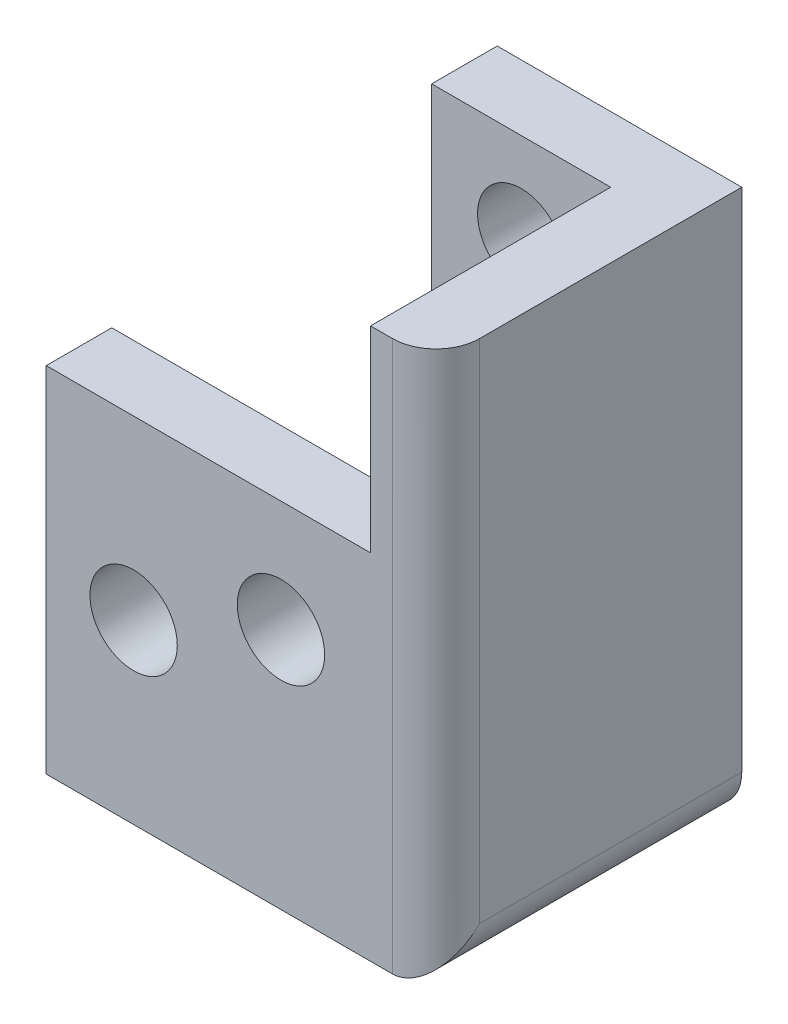
ISO-10303-21;
HEADER;
FILE_DESCRIPTION(('STEP AP214'),'2;1');
FILE_NAME('part.step','',(''),(''),'','','');
FILE_SCHEMA(('AUTOMOTIVE_DESIGN { 1 0 10303 214 1 1 1 1 }'));
ENDSEC;
DATA;
#1=APPLICATION_CONTEXT('core data for automotive mechanical design processes');
#2=APPLICATION_PROTOCOL_DEFINITION('international standard','automotive_design',2000,#1);
#3=PRODUCT_CONTEXT('',#1,'mechanical');
#4=PRODUCT('Part','Part','',(#3));
#5=PRODUCT_RELATED_PRODUCT_CATEGORY('part','',(#4));
#6=PRODUCT_DEFINITION_FORMATION('','',#4);
#7=PRODUCT_DEFINITION_CONTEXT('part definition',#1,'design');
#8=PRODUCT_DEFINITION('design','',#6,#7);
#9=PRODUCT_DEFINITION_SHAPE('','',#8);
#10=(LENGTH_UNIT() NAMED_UNIT(*) SI_UNIT(.MILLI.,.METRE.));
#11=(NAMED_UNIT(*) PLANE_ANGLE_UNIT() SI_UNIT($,.RADIAN.));
#12=(NAMED_UNIT(*) SI_UNIT($,.STERADIAN.) SOLID_ANGLE_UNIT());
#13=UNCERTAINTY_MEASURE_WITH_UNIT(LENGTH_MEASURE(1.E-05),#10,'distance_accuracy_value','');
#14=(GEOMETRIC_REPRESENTATION_CONTEXT(3) GLOBAL_UNCERTAINTY_ASSIGNED_CONTEXT((#13)) GLOBAL_UNIT_ASSIGNED_CONTEXT((#10,
#11,#12)) REPRESENTATION_CONTEXT('',''));
#15=CARTESIAN_POINT('',(0.,0.,0.));
#16=DIRECTION('',(0.,0.,1.));
#17=DIRECTION('',(1.,0.,0.));
#18=AXIS2_PLACEMENT_3D('',#15,#16,#17);
#19=CARTESIAN_POINT('',(31.36,9.1,5.));
#20=DIRECTION('',(0.,0.,-1.));
#21=DIRECTION('',(-1.,0.,0.));
#22=AXIS2_PLACEMENT_3D('',#19,#20,#21);
#23=PLANE('',#22);
#24=DIRECTION('',(0.,1.,0.));
#25=VECTOR('',#24,1.);
#26=CARTESIAN_POINT('',(20.15,-34.028747864812,5.));
#27=LINE('',#26,#25);
#28=CARTESIAN_POINT('',(20.15,-16.1,5.));
#29=VERTEX_POINT('',#28);
#30=CARTESIAN_POINT('',(20.15,9.1,5.));
#31=VERTEX_POINT('',#30);
#32=EDGE_CURVE('E223',#29,#31,#27,.T.);
#33=ORIENTED_EDGE('',*,*,#32,.T.);
#34=DIRECTION('',(-1.,0.,0.));
#35=VECTOR('',#34,1.);
#36=CARTESIAN_POINT('',(28.35,9.1,5.));
#37=LINE('',#36,#35);
#38=CARTESIAN_POINT('',(31.35,9.1,5.));
#39=VERTEX_POINT('',#38);
#40=EDGE_CURVE('E189',#39,#31,#37,.T.);
#41=ORIENTED_EDGE('',*,*,#40,.F.);
#42=DIRECTION('',(0.,1.,0.));
#43=VECTOR('',#42,1.);
#44=CARTESIAN_POINT('',(31.35,-9.9,5.));
#45=LINE('',#44,#43);
#46=CARTESIAN_POINT('',(31.35,-14.1,5.));
#47=VERTEX_POINT('',#46);
#48=EDGE_CURVE('E132',#47,#39,#45,.T.);
#49=ORIENTED_EDGE('',*,*,#48,.F.);
#50=CARTESIAN_POINT('',(29.35,-14.1,5.));
#51=DIRECTION('',(0.,0.,-1.));
#52=DIRECTION('',(-1.,0.,0.));
#53=AXIS2_PLACEMENT_3D('',#50,#51,#52);
#54=CIRCLE('',#53,2.);
#55=CARTESIAN_POINT('',(29.35,-16.1,5.));
#56=VERTEX_POINT('',#55);
#57=EDGE_CURVE('E126',#47,#56,#54,.T.);
#58=ORIENTED_EDGE('',*,*,#57,.T.);
#59=DIRECTION('',(1.,0.,0.));
#60=VECTOR('',#59,1.);
#61=CARTESIAN_POINT('',(31.35,-16.1,5.));
#62=LINE('',#61,#60);
#63=EDGE_CURVE('E129',#29,#56,#62,.T.);
#64=ORIENTED_EDGE('',*,*,#63,.F.);
#65=EDGE_LOOP('',(#33,#41,#49,#58,#64));
#66=FACE_BOUND('',#65,.T.);
#67=CARTESIAN_POINT('',(24.25,-5.,5.));
#68=DIRECTION('',(0.,0.,1.));
#69=DIRECTION('',(1.,0.,0.));
#70=AXIS2_PLACEMENT_3D('',#67,#68,#69);
#71=CIRCLE('',#70,2.06222730848998);
#72=CARTESIAN_POINT('',(26.31222730849,-5.,5.));
#73=VERTEX_POINT('',#72);
#74=EDGE_CURVE('E41',#73,#73,#71,.F.);
#75=ORIENTED_EDGE('',*,*,#74,.F.);
#76=EDGE_LOOP('',(#75));
#77=FACE_BOUND('',#76,.T.);
#78=CARTESIAN_POINT('',(24.25,5.,5.));
#79=DIRECTION('',(0.,0.,-1.));
#80=DIRECTION('',(-1.,0.,0.));
#81=AXIS2_PLACEMENT_3D('',#78,#79,#80);
#82=CIRCLE('',#81,1.99999999999997);
#83=CARTESIAN_POINT('',(22.25,5.,5.));
#84=VERTEX_POINT('',#83);
#85=EDGE_CURVE('E137',#84,#84,#82,.T.);
#86=ORIENTED_EDGE('',*,*,#85,.F.);
#87=EDGE_LOOP('',(#86));
#88=FACE_BOUND('',#87,.T.);
#89=ADVANCED_FACE('F37',(#66,#77,#88),#23,.T.);
#90=CARTESIAN_POINT('',(24.25,5.,5.));
#91=DIRECTION('',(0.,0.,-1.));
#92=DIRECTION('',(-1.,0.,0.));
#93=AXIS2_PLACEMENT_3D('',#90,#91,#92);
#94=CYLINDRICAL_SURFACE('',#93,1.99999999999997);
#95=CARTESIAN_POINT('',(24.25,5.,8.));
#96=DIRECTION('',(0.,0.,1.));
#97=DIRECTION('',(1.,0.,0.));
#98=AXIS2_PLACEMENT_3D('',#95,#96,#97);
#99=CIRCLE('',#98,1.99999999999997);
#100=CARTESIAN_POINT('',(26.25,5.,8.));
#101=VERTEX_POINT('',#100);
#102=EDGE_CURVE('E172',#101,#101,#99,.T.);
#103=ORIENTED_EDGE('',*,*,#102,.T.);
#104=EDGE_LOOP('',(#103));
#105=FACE_BOUND('',#104,.T.);
#106=ORIENTED_EDGE('',*,*,#85,.T.);
#107=EDGE_LOOP('',(#106));
#108=FACE_BOUND('',#107,.T.);
#109=ADVANCED_FACE('F39',(#105,#108),#94,.F.);
#110=CARTESIAN_POINT('',(28.35,-9.9,19.));
#111=DIRECTION('',(1.,0.,0.));
#112=DIRECTION('',(0.,0.,-1.));
#113=AXIS2_PLACEMENT_3D('',#110,#111,#112);
#114=PLANE('',#113);
#115=DIRECTION('',(0.,0.,-1.));
#116=VECTOR('',#115,1.);
#117=CARTESIAN_POINT('',(28.35,-13.1,24.7315519811772));
#118=LINE('',#117,#116);
#119=CARTESIAN_POINT('',(28.35,-13.1,16.));
#120=VERTEX_POINT('',#119);
#121=CARTESIAN_POINT('',(28.35,-13.1,8.));
#122=VERTEX_POINT('',#121);
#123=EDGE_CURVE('E54',#120,#122,#118,.T.);
#124=ORIENTED_EDGE('',*,*,#123,.F.);
#125=DIRECTION('',(0.,1.,0.));
#126=VECTOR('',#125,1.);
#127=CARTESIAN_POINT('',(28.35,-9.9,16.));
#128=LINE('',#127,#126);
#129=CARTESIAN_POINT('',(28.35,0.0999999999999994,16.));
#130=VERTEX_POINT('',#129);
#131=EDGE_CURVE('E205',#120,#130,#128,.T.);
#132=ORIENTED_EDGE('',*,*,#131,.T.);
#133=DIRECTION('',(0.,0.,1.));
#134=VECTOR('',#133,1.);
#135=CARTESIAN_POINT('',(28.35,0.0999999999999994,16.));
#136=LINE('',#135,#134);
#137=CARTESIAN_POINT('',(28.35,0.0999999999999994,19.));
#138=VERTEX_POINT('',#137);
#139=EDGE_CURVE('E194',#130,#138,#136,.T.);
#140=ORIENTED_EDGE('',*,*,#139,.T.);
#141=DIRECTION('',(0.,-1.,0.));
#142=VECTOR('',#141,1.);
#143=CARTESIAN_POINT('',(28.35,-9.9,19.));
#144=LINE('',#143,#142);
#145=CARTESIAN_POINT('',(28.35,9.1,19.));
#146=VERTEX_POINT('',#145);
#147=EDGE_CURVE('E186',#146,#138,#144,.T.);
#148=ORIENTED_EDGE('',*,*,#147,.F.);
#149=DIRECTION('',(0.,0.,-1.));
#150=VECTOR('',#149,1.);
#151=CARTESIAN_POINT('',(28.35,9.1,19.));
#152=LINE('',#151,#150);
#153=CARTESIAN_POINT('',(28.35,9.1,8.));
#154=VERTEX_POINT('',#153);
#155=EDGE_CURVE('E181',#146,#154,#152,.T.);
#156=ORIENTED_EDGE('',*,*,#155,.T.);
#157=DIRECTION('',(0.,1.,0.));
#158=VECTOR('',#157,1.);
#159=CARTESIAN_POINT('',(28.35,-9.9,8.));
#160=LINE('',#159,#158);
#161=EDGE_CURVE('E167',#122,#154,#160,.T.);
#162=ORIENTED_EDGE('',*,*,#161,.F.);
#163=EDGE_LOOP('',(#124,#132,#140,#148,#156,#162));
#164=FACE_BOUND('',#163,.T.);
#165=ADVANCED_FACE('F249',(#164),#114,.F.);
#166=CARTESIAN_POINT('',(17.5,-8.,16.));
#167=DIRECTION('',(0.,0.,1.));
#168=DIRECTION('',(1.,0.,0.));
#169=AXIS2_PLACEMENT_3D('',#166,#167,#168);
#170=CYLINDRICAL_SURFACE('',#169,2.);
#171=CARTESIAN_POINT('',(17.5,-8.,16.));
#172=DIRECTION('',(0.,0.,1.));
#173=DIRECTION('',(1.,0.,0.));
#174=AXIS2_PLACEMENT_3D('',#171,#172,#173);
#175=CIRCLE('',#174,2.);
#176=CARTESIAN_POINT('',(19.5,-8.,16.));
#177=VERTEX_POINT('',#176);
#178=EDGE_CURVE('E211',#177,#177,#175,.T.);
#179=ORIENTED_EDGE('',*,*,#178,.F.);
#180=EDGE_LOOP('',(#179));
#181=FACE_BOUND('',#180,.T.);
#182=CARTESIAN_POINT('',(17.5,-8.,19.));
#183=DIRECTION('',(0.,0.,1.));
#184=DIRECTION('',(1.,0.,0.));
#185=AXIS2_PLACEMENT_3D('',#182,#183,#184);
#186=CIRCLE('',#185,2.);
#187=CARTESIAN_POINT('',(19.5,-8.,19.));
#188=VERTEX_POINT('',#187);
#189=EDGE_CURVE('E146',#188,#188,#186,.T.);
#190=ORIENTED_EDGE('',*,*,#189,.T.);
#191=EDGE_LOOP('',(#190));
#192=FACE_BOUND('',#191,.T.);
#193=ADVANCED_FACE('F278',(#181,#192),#170,.F.);
#194=CARTESIAN_POINT('',(24.25,-5.,24.6568542494924));
#195=DIRECTION('',(0.,0.,-1.));
#196=DIRECTION('',(-1.,0.,0.));
#197=AXIS2_PLACEMENT_3D('',#194,#195,#196);
#198=CYLINDRICAL_SURFACE('',#197,2.);
#199=CARTESIAN_POINT('',(24.25,-5.,19.));
#200=DIRECTION('',(0.,0.,-1.));
#201=DIRECTION('',(-1.,0.,0.));
#202=AXIS2_PLACEMENT_3D('',#199,#200,#201);
#203=CIRCLE('',#202,2.);
#204=CARTESIAN_POINT('',(22.25,-5.,19.));
#205=VERTEX_POINT('',#204);
#206=EDGE_CURVE('E232',#205,#205,#203,.F.);
#207=ORIENTED_EDGE('',*,*,#206,.T.);
#208=EDGE_LOOP('',(#207));
#209=FACE_BOUND('',#208,.T.);
#210=CARTESIAN_POINT('',(24.25,-5.,16.));
#211=DIRECTION('',(0.,0.,-1.));
#212=DIRECTION('',(-1.,0.,0.));
#213=AXIS2_PLACEMENT_3D('',#210,#211,#212);
#214=CIRCLE('',#213,2.);
#215=CARTESIAN_POINT('',(22.25,-5.,16.));
#216=VERTEX_POINT('',#215);
#217=EDGE_CURVE('E46',#216,#216,#214,.T.);
#218=ORIENTED_EDGE('',*,*,#217,.T.);
#219=EDGE_LOOP('',(#218));
#220=FACE_BOUND('',#219,.T.);
#221=ADVANCED_FACE('F274',(#209,#220),#198,.F.);
#222=CARTESIAN_POINT('',(0.,0.,8.));
#223=DIRECTION('',(0.,0.,-1.));
#224=DIRECTION('',(-1.,0.,0.));
#225=AXIS2_PLACEMENT_3D('',#222,#223,#224);
#226=PLANE('',#225);
#227=CARTESIAN_POINT('',(24.25,-5.,8.));
#228=DIRECTION('',(0.,0.,1.));
#229=DIRECTION('',(1.,0.,0.));
#230=AXIS2_PLACEMENT_3D('',#227,#228,#229);
#231=CIRCLE('',#230,2.06222730848998);
#232=CARTESIAN_POINT('',(26.31222730849,-5.,8.));
#233=VERTEX_POINT('',#232);
#234=EDGE_CURVE('E175',#233,#233,#231,.T.);
#235=ORIENTED_EDGE('',*,*,#234,.F.);
#236=EDGE_LOOP('',(#235));
#237=FACE_BOUND('',#236,.T.);
#238=ORIENTED_EDGE('',*,*,#102,.F.);
#239=EDGE_LOOP('',(#238));
#240=FACE_BOUND('',#239,.T.);
#241=DIRECTION('',(-1.,0.,0.));
#242=VECTOR('',#241,1.);
#243=CARTESIAN_POINT('',(28.35,-13.1,8.));
#244=LINE('',#243,#242);
#245=CARTESIAN_POINT('',(20.15,-13.1,8.));
#246=VERTEX_POINT('',#245);
#247=EDGE_CURVE('E230',#122,#246,#244,.T.);
#248=ORIENTED_EDGE('',*,*,#247,.F.);
#249=ORIENTED_EDGE('',*,*,#161,.T.);
#250=DIRECTION('',(-1.,0.,0.));
#251=VECTOR('',#250,1.);
#252=CARTESIAN_POINT('',(20.15,9.1,8.));
#253=LINE('',#252,#251);
#254=CARTESIAN_POINT('',(20.15,9.1,8.));
#255=VERTEX_POINT('',#254);
#256=EDGE_CURVE('E165',#154,#255,#253,.T.);
#257=ORIENTED_EDGE('',*,*,#256,.T.);
#258=DIRECTION('',(0.,-1.,0.));
#259=VECTOR('',#258,1.);
#260=CARTESIAN_POINT('',(20.15,-9.9,8.));
#261=LINE('',#260,#259);
#262=EDGE_CURVE('E169',#255,#246,#261,.T.);
#263=ORIENTED_EDGE('',*,*,#262,.T.);
#264=EDGE_LOOP('',(#248,#249,#257,#263));
#265=FACE_BOUND('',#264,.T.);
#266=ADVANCED_FACE('F271',(#237,#240,#265),#226,.F.);
#267=CARTESIAN_POINT('',(28.35,-13.1,24.7315519811772));
#268=DIRECTION('',(0.,-1.,0.));
#269=DIRECTION('',(0.,0.,-1.));
#270=AXIS2_PLACEMENT_3D('',#267,#268,#269);
#271=PLANE('',#270);
#272=DIRECTION('',(0.,0.,-1.));
#273=VECTOR('',#272,1.);
#274=CARTESIAN_POINT('',(20.15,-13.1,24.7315519811772));
#275=LINE('',#274,#273);
#276=CARTESIAN_POINT('',(20.15,-13.1,16.));
#277=VERTEX_POINT('',#276);
#278=EDGE_CURVE('E62',#277,#246,#275,.T.);
#279=ORIENTED_EDGE('',*,*,#278,.F.);
#280=DIRECTION('',(1.,0.,0.));
#281=VECTOR('',#280,1.);
#282=CARTESIAN_POINT('',(28.35,-13.1,16.));
#283=LINE('',#282,#281);
#284=EDGE_CURVE('E225',#277,#120,#283,.T.);
#285=ORIENTED_EDGE('',*,*,#284,.T.);
#286=ORIENTED_EDGE('',*,*,#123,.T.);
#287=ORIENTED_EDGE('',*,*,#247,.T.);
#288=EDGE_LOOP('',(#279,#285,#286,#287));
#289=FACE_BOUND('',#288,.T.);
#290=ADVANCED_FACE('F273',(#289),#271,.F.);
#291=CARTESIAN_POINT('',(0.,0.,16.));
#292=DIRECTION('',(0.,0.,-1.));
#293=DIRECTION('',(-1.,0.,0.));
#294=AXIS2_PLACEMENT_3D('',#291,#292,#293);
#295=PLANE('',#294);
#296=ORIENTED_EDGE('',*,*,#217,.F.);
#297=EDGE_LOOP('',(#296));
#298=FACE_BOUND('',#297,.T.);
#299=ORIENTED_EDGE('',*,*,#178,.T.);
#300=EDGE_LOOP('',(#299));
#301=FACE_BOUND('',#300,.T.);
#302=ORIENTED_EDGE('',*,*,#284,.F.);
#303=DIRECTION('',(0.,1.,0.));
#304=VECTOR('',#303,1.);
#305=CARTESIAN_POINT('',(20.15,-16.1,16.));
#306=LINE('',#305,#304);
#307=CARTESIAN_POINT('',(20.15,-16.1,16.));
#308=VERTEX_POINT('',#307);
#309=EDGE_CURVE('E228',#308,#277,#306,.T.);
#310=ORIENTED_EDGE('',*,*,#309,.F.);
#311=DIRECTION('',(1.,0.,0.));
#312=VECTOR('',#311,1.);
#313=CARTESIAN_POINT('',(28.35,-16.1,16.));
#314=LINE('',#313,#312);
#315=CARTESIAN_POINT('',(13.5,-16.1,16.));
#316=VERTEX_POINT('',#315);
#317=EDGE_CURVE('E197',#316,#308,#314,.T.);
#318=ORIENTED_EDGE('',*,*,#317,.F.);
#319=DIRECTION('',(0.,-1.,0.));
#320=VECTOR('',#319,1.);
#321=CARTESIAN_POINT('',(13.5,-9.9,16.));
#322=LINE('',#321,#320);
#323=CARTESIAN_POINT('',(13.5,0.0999999999999994,16.));
#324=VERTEX_POINT('',#323);
#325=EDGE_CURVE('E213',#324,#316,#322,.T.);
#326=ORIENTED_EDGE('',*,*,#325,.F.);
#327=DIRECTION('',(-1.,0.,0.));
#328=VECTOR('',#327,1.);
#329=CARTESIAN_POINT('',(28.35,0.0999999999999994,16.));
#330=LINE('',#329,#328);
#331=EDGE_CURVE('E215',#130,#324,#330,.T.);
#332=ORIENTED_EDGE('',*,*,#331,.F.);
#333=ORIENTED_EDGE('',*,*,#131,.F.);
#334=EDGE_LOOP('',(#302,#310,#318,#326,#332,#333));
#335=FACE_BOUND('',#334,.T.);
#336=ADVANCED_FACE('F291',(#298,#301,#335),#295,.T.);
#337=CARTESIAN_POINT('',(28.35,0.0999999999999994,16.));
#338=DIRECTION('',(0.,1.,0.));
#339=DIRECTION('',(0.,0.,1.));
#340=AXIS2_PLACEMENT_3D('',#337,#338,#339);
#341=PLANE('',#340);
#342=DIRECTION('',(-1.,0.,0.));
#343=VECTOR('',#342,1.);
#344=CARTESIAN_POINT('',(28.35,0.0999999999999994,19.));
#345=LINE('',#344,#343);
#346=CARTESIAN_POINT('',(13.5,0.0999999999999994,19.));
#347=VERTEX_POINT('',#346);
#348=EDGE_CURVE('E208',#138,#347,#345,.T.);
#349=ORIENTED_EDGE('',*,*,#348,.F.);
#350=ORIENTED_EDGE('',*,*,#139,.F.);
#351=ORIENTED_EDGE('',*,*,#331,.T.);
#352=DIRECTION('',(0.,0.,1.));
#353=VECTOR('',#352,1.);
#354=CARTESIAN_POINT('',(13.5,0.0999999999999994,16.));
#355=LINE('',#354,#353);
#356=EDGE_CURVE('E198',#324,#347,#355,.T.);
#357=ORIENTED_EDGE('',*,*,#356,.T.);
#358=EDGE_LOOP('',(#349,#350,#351,#357));
#359=FACE_BOUND('',#358,.T.);
#360=ADVANCED_FACE('F287',(#359),#341,.T.);
#361=CARTESIAN_POINT('',(0.,0.,19.));
#362=DIRECTION('',(0.,0.,-1.));
#363=DIRECTION('',(-1.,0.,0.));
#364=AXIS2_PLACEMENT_3D('',#361,#362,#363);
#365=PLANE('',#364);
#366=ORIENTED_EDGE('',*,*,#206,.F.);
#367=EDGE_LOOP('',(#366));
#368=FACE_BOUND('',#367,.T.);
#369=DIRECTION('',(1.,0.,0.));
#370=VECTOR('',#369,1.);
#371=CARTESIAN_POINT('',(28.35,-16.1,19.));
#372=LINE('',#371,#370);
#373=CARTESIAN_POINT('',(13.5,-16.1,19.));
#374=VERTEX_POINT('',#373);
#375=CARTESIAN_POINT('',(29.35,-16.1,19.));
#376=VERTEX_POINT('',#375);
#377=EDGE_CURVE('E202',#374,#376,#372,.T.);
#378=ORIENTED_EDGE('',*,*,#377,.T.);
#379=DIRECTION('',(0.,1.,0.));
#380=VECTOR('',#379,1.);
#381=CARTESIAN_POINT('',(29.35,0.,19.));
#382=LINE('',#381,#380);
#383=CARTESIAN_POINT('',(29.35,9.1,19.));
#384=VERTEX_POINT('',#383);
#385=EDGE_CURVE('E159',#376,#384,#382,.T.);
#386=ORIENTED_EDGE('',*,*,#385,.T.);
#387=DIRECTION('',(-1.,0.,0.));
#388=VECTOR('',#387,1.);
#389=CARTESIAN_POINT('',(28.35,9.1,19.));
#390=LINE('',#389,#388);
#391=EDGE_CURVE('E184',#384,#146,#390,.T.);
#392=ORIENTED_EDGE('',*,*,#391,.T.);
#393=ORIENTED_EDGE('',*,*,#147,.T.);
#394=ORIENTED_EDGE('',*,*,#348,.T.);
#395=DIRECTION('',(0.,-1.,0.));
#396=VECTOR('',#395,1.);
#397=CARTESIAN_POINT('',(13.5,-9.9,19.));
#398=LINE('',#397,#396);
#399=EDGE_CURVE('E204',#347,#374,#398,.T.);
#400=ORIENTED_EDGE('',*,*,#399,.T.);
#401=EDGE_LOOP('',(#378,#386,#392,#393,#394,#400));
#402=FACE_BOUND('',#401,.T.);
#403=ORIENTED_EDGE('',*,*,#189,.F.);
#404=EDGE_LOOP('',(#403));
#405=FACE_BOUND('',#404,.T.);
#406=ADVANCED_FACE('F283',(#368,#402,#405),#365,.F.);
#407=CARTESIAN_POINT('',(31.35,-9.9,19.));
#408=DIRECTION('',(-1.,0.,0.));
#409=DIRECTION('',(0.,0.,1.));
#410=AXIS2_PLACEMENT_3D('',#407,#408,#409);
#411=PLANE('',#410);
#412=DIRECTION('',(0.,0.,-1.));
#413=VECTOR('',#412,1.);
#414=CARTESIAN_POINT('',(31.35,9.1,19.));
#415=LINE('',#414,#413);
#416=CARTESIAN_POINT('',(31.35,9.1,17.));
#417=VERTEX_POINT('',#416);
#418=EDGE_CURVE('E178',#417,#39,#415,.T.);
#419=ORIENTED_EDGE('',*,*,#418,.F.);
#420=DIRECTION('',(0.,1.,0.));
#421=VECTOR('',#420,1.);
#422=CARTESIAN_POINT('',(31.35,-9.9,17.));
#423=LINE('',#422,#421);
#424=CARTESIAN_POINT('',(31.35,-14.1,17.));
#425=VERTEX_POINT('',#424);
#426=EDGE_CURVE('E151',#417,#425,#423,.F.);
#427=ORIENTED_EDGE('',*,*,#426,.T.);
#428=DIRECTION('',(0.,0.,1.));
#429=VECTOR('',#428,1.);
#430=CARTESIAN_POINT('',(31.35,-14.1,5.));
#431=LINE('',#430,#429);
#432=EDGE_CURVE('E153',#425,#47,#431,.F.);
#433=ORIENTED_EDGE('',*,*,#432,.T.);
#434=ORIENTED_EDGE('',*,*,#48,.T.);
#435=EDGE_LOOP('',(#419,#427,#433,#434));
#436=FACE_BOUND('',#435,.T.);
#437=ADVANCED_FACE('F280',(#436),#411,.F.);
#438=CARTESIAN_POINT('',(29.35,-14.1,16.));
#439=DIRECTION('',(0.,0.,-1.));
#440=DIRECTION('',(-1.,0.,0.));
#441=AXIS2_PLACEMENT_3D('',#438,#439,#440);
#442=CYLINDRICAL_SURFACE('',#441,2.);
#443=ORIENTED_EDGE('',*,*,#57,.F.);
#444=ORIENTED_EDGE('',*,*,#432,.F.);
#445=CARTESIAN_POINT('',(29.35,-14.1,17.));
#446=DIRECTION('',(0.,-0.707106781186547,-0.707106781186547));
#447=DIRECTION('',(0.,0.707106781186547,-0.707106781186547));
#448=AXIS2_PLACEMENT_3D('',#445,#446,#447);
#449=ELLIPSE('',#448,2.82842712474619,2.);
#450=EDGE_CURVE('E11',#376,#425,#449,.F.);
#451=ORIENTED_EDGE('',*,*,#450,.F.);
#452=DIRECTION('',(0.,0.,1.));
#453=VECTOR('',#452,1.);
#454=CARTESIAN_POINT('',(29.35,-16.1,19.));
#455=LINE('',#454,#453);
#456=EDGE_CURVE('E136',#56,#376,#455,.T.);
#457=ORIENTED_EDGE('',*,*,#456,.F.);
#458=EDGE_LOOP('',(#443,#444,#451,#457));
#459=FACE_BOUND('',#458,.T.);
#460=ADVANCED_FACE('F149',(#459),#442,.T.);
#461=CARTESIAN_POINT('',(29.35,0.,17.));
#462=DIRECTION('',(0.,1.,0.));
#463=DIRECTION('',(0.,0.,1.));
#464=AXIS2_PLACEMENT_3D('',#461,#462,#463);
#465=CYLINDRICAL_SURFACE('',#464,2.);
#466=ORIENTED_EDGE('',*,*,#450,.T.);
#467=ORIENTED_EDGE('',*,*,#426,.F.);
#468=CARTESIAN_POINT('',(29.35,9.1,17.));
#469=DIRECTION('',(0.,-1.,0.));
#470=DIRECTION('',(0.,0.,-1.));
#471=AXIS2_PLACEMENT_3D('',#468,#469,#470);
#472=CIRCLE('',#471,2.);
#473=EDGE_CURVE('E157',#384,#417,#472,.F.);
#474=ORIENTED_EDGE('',*,*,#473,.F.);
#475=ORIENTED_EDGE('',*,*,#385,.F.);
#476=EDGE_LOOP('',(#466,#467,#474,#475));
#477=FACE_BOUND('',#476,.T.);
#478=ADVANCED_FACE('F269',(#477),#465,.T.);
#479=CARTESIAN_POINT('',(13.5,-9.9,16.));
#480=DIRECTION('',(-1.,0.,0.));
#481=DIRECTION('',(0.,-1.,0.));
#482=AXIS2_PLACEMENT_3D('',#479,#480,#481);
#483=PLANE('',#482);
#484=ORIENTED_EDGE('',*,*,#399,.F.);
#485=ORIENTED_EDGE('',*,*,#356,.F.);
#486=ORIENTED_EDGE('',*,*,#325,.T.);
#487=DIRECTION('',(0.,0.,1.));
#488=VECTOR('',#487,1.);
#489=CARTESIAN_POINT('',(13.5,-16.1,16.));
#490=LINE('',#489,#488);
#491=EDGE_CURVE('E193',#316,#374,#490,.T.);
#492=ORIENTED_EDGE('',*,*,#491,.T.);
#493=EDGE_LOOP('',(#484,#485,#486,#492));
#494=FACE_BOUND('',#493,.T.);
#495=ADVANCED_FACE('F293',(#494),#483,.T.);
#496=CARTESIAN_POINT('',(20.15,0.,5.));
#497=DIRECTION('',(-1.,0.,0.));
#498=DIRECTION('',(0.,0.,1.));
#499=AXIS2_PLACEMENT_3D('',#496,#497,#498);
#500=PLANE('',#499);
#501=DIRECTION('',(0.,0.,-1.));
#502=VECTOR('',#501,1.);
#503=CARTESIAN_POINT('',(20.15,9.1,8.));
#504=LINE('',#503,#502);
#505=EDGE_CURVE('E162',#255,#31,#504,.T.);
#506=ORIENTED_EDGE('',*,*,#505,.T.);
#507=ORIENTED_EDGE('',*,*,#32,.F.);
#508=DIRECTION('',(0.,0.,-1.));
#509=VECTOR('',#508,1.);
#510=CARTESIAN_POINT('',(20.15,-16.1,5.));
#511=LINE('',#510,#509);
#512=EDGE_CURVE('E145',#308,#29,#511,.T.);
#513=ORIENTED_EDGE('',*,*,#512,.F.);
#514=ORIENTED_EDGE('',*,*,#309,.T.);
#515=ORIENTED_EDGE('',*,*,#278,.T.);
#516=ORIENTED_EDGE('',*,*,#262,.F.);
#517=EDGE_LOOP('',(#506,#507,#513,#514,#515,#516));
#518=FACE_BOUND('',#517,.T.);
#519=ADVANCED_FACE('F263',(#518),#500,.T.);
#520=CARTESIAN_POINT('',(24.25,-5.,8.));
#521=DIRECTION('',(0.,0.,-1.));
#522=DIRECTION('',(-1.,0.,0.));
#523=AXIS2_PLACEMENT_3D('',#520,#521,#522);
#524=CYLINDRICAL_SURFACE('',#523,2.06222730848998);
#525=ORIENTED_EDGE('',*,*,#234,.T.);
#526=EDGE_LOOP('',(#525));
#527=FACE_BOUND('',#526,.T.);
#528=ORIENTED_EDGE('',*,*,#74,.T.);
#529=EDGE_LOOP('',(#528));
#530=FACE_BOUND('',#529,.T.);
#531=ADVANCED_FACE('F255',(#527,#530),#524,.F.);
#532=CARTESIAN_POINT('',(20.15,9.1,8.));
#533=DIRECTION('',(0.,-1.,0.));
#534=DIRECTION('',(0.,0.,-1.));
#535=AXIS2_PLACEMENT_3D('',#532,#533,#534);
#536=PLANE('',#535);
#537=ORIENTED_EDGE('',*,*,#391,.F.);
#538=ORIENTED_EDGE('',*,*,#473,.T.);
#539=ORIENTED_EDGE('',*,*,#418,.T.);
#540=ORIENTED_EDGE('',*,*,#40,.T.);
#541=ORIENTED_EDGE('',*,*,#505,.F.);
#542=ORIENTED_EDGE('',*,*,#256,.F.);
#543=ORIENTED_EDGE('',*,*,#155,.F.);
#544=EDGE_LOOP('',(#537,#538,#539,#540,#541,#542,#543));
#545=FACE_BOUND('',#544,.T.);
#546=ADVANCED_FACE('F251',(#545),#536,.F.);
#547=CARTESIAN_POINT('',(28.35,-16.1,16.));
#548=DIRECTION('',(0.,-1.,0.));
#549=DIRECTION('',(0.,0.,-1.));
#550=AXIS2_PLACEMENT_3D('',#547,#548,#549);
#551=PLANE('',#550);
#552=ORIENTED_EDGE('',*,*,#63,.T.);
#553=ORIENTED_EDGE('',*,*,#456,.T.);
#554=ORIENTED_EDGE('',*,*,#377,.F.);
#555=ORIENTED_EDGE('',*,*,#491,.F.);
#556=ORIENTED_EDGE('',*,*,#317,.T.);
#557=ORIENTED_EDGE('',*,*,#512,.T.);
#558=EDGE_LOOP('',(#552,#553,#554,#555,#556,#557));
#559=FACE_BOUND('',#558,.T.);
#560=ADVANCED_FACE('F141',(#559),#551,.T.);
#561=CLOSED_SHELL('',(#89,#109,#165,#193,#221,#266,#290,#336,#360,#406,#437,#460,#478,#495,#519,
#531,#546,#560));
#562=MANIFOLD_SOLID_BREP('B2',#561);
#563=ADVANCED_BREP_SHAPE_REPRESENTATION('',(#18,#562),#14);
#564=SHAPE_DEFINITION_REPRESENTATION(#9,#563);
ENDSEC;
END-ISO-10303-21;
